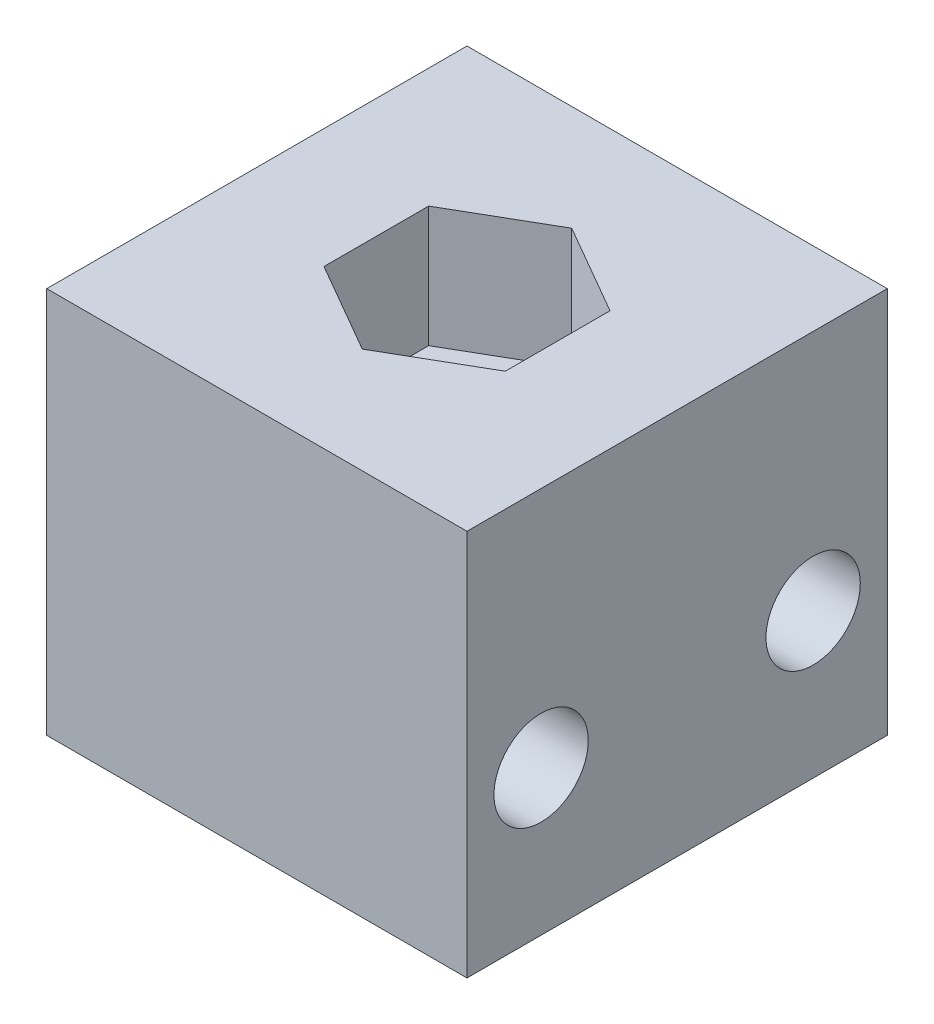
ISO-10303-21;
HEADER;
FILE_DESCRIPTION(('STEP AP214'),'2;1');
FILE_NAME('part.step','',(''),(''),'','','');
FILE_SCHEMA(('AUTOMOTIVE_DESIGN { 1 0 10303 214 1 1 1 1 }'));
ENDSEC;
DATA;
#1=APPLICATION_CONTEXT('core data for automotive mechanical design processes');
#2=APPLICATION_PROTOCOL_DEFINITION('international standard','automotive_design',2000,#1);
#3=PRODUCT_CONTEXT('',#1,'mechanical');
#4=PRODUCT('Part','Part','',(#3));
#5=PRODUCT_RELATED_PRODUCT_CATEGORY('part','',(#4));
#6=PRODUCT_DEFINITION_FORMATION('','',#4);
#7=PRODUCT_DEFINITION_CONTEXT('part definition',#1,'design');
#8=PRODUCT_DEFINITION('design','',#6,#7);
#9=PRODUCT_DEFINITION_SHAPE('','',#8);
#10=(LENGTH_UNIT() NAMED_UNIT(*) SI_UNIT(.MILLI.,.METRE.));
#11=(NAMED_UNIT(*) PLANE_ANGLE_UNIT() SI_UNIT($,.RADIAN.));
#12=(NAMED_UNIT(*) SI_UNIT($,.STERADIAN.) SOLID_ANGLE_UNIT());
#13=UNCERTAINTY_MEASURE_WITH_UNIT(LENGTH_MEASURE(1.E-05),#10,'distance_accuracy_value','');
#14=(GEOMETRIC_REPRESENTATION_CONTEXT(3) GLOBAL_UNCERTAINTY_ASSIGNED_CONTEXT((#13)) GLOBAL_UNIT_ASSIGNED_CONTEXT((#10,
#11,#12)) REPRESENTATION_CONTEXT('',''));
#15=CARTESIAN_POINT('',(0.,0.,0.));
#16=DIRECTION('',(0.,0.,1.));
#17=DIRECTION('',(1.,0.,0.));
#18=AXIS2_PLACEMENT_3D('',#15,#16,#17);
#19=CARTESIAN_POINT('',(0.,0.,0.));
#20=DIRECTION('',(0.,-1.,0.));
#21=DIRECTION('',(0.,0.,-1.));
#22=AXIS2_PLACEMENT_3D('',#19,#20,#21);
#23=CYLINDRICAL_SURFACE('',#22,2.4892);
#24=CARTESIAN_POINT('',(0.,0.,0.));
#25=DIRECTION('',(0.,-1.,0.));
#26=DIRECTION('',(0.,0.,-1.));
#27=AXIS2_PLACEMENT_3D('',#24,#25,#26);
#28=CIRCLE('',#27,2.4892);
#29=CARTESIAN_POINT('',(0.,0.,-2.4892));
#30=VERTEX_POINT('',#29);
#31=EDGE_CURVE('E182',#30,#30,#28,.T.);
#32=ORIENTED_EDGE('',*,*,#31,.T.);
#33=EDGE_LOOP('',(#32));
#34=FACE_BOUND('',#33,.T.);
#35=CARTESIAN_POINT('',(0.,13.97,0.));
#36=DIRECTION('',(0.,1.,0.));
#37=DIRECTION('',(0.,0.,1.));
#38=AXIS2_PLACEMENT_3D('',#35,#36,#37);
#39=CIRCLE('',#38,2.4892);
#40=CARTESIAN_POINT('',(0.,13.97,2.4892));
#41=VERTEX_POINT('',#40);
#42=EDGE_CURVE('E41',#41,#41,#39,.F.);
#43=ORIENTED_EDGE('',*,*,#42,.F.);
#44=EDGE_LOOP('',(#43));
#45=FACE_BOUND('',#44,.T.);
#46=ADVANCED_FACE('F37',(#34,#45),#23,.F.);
#47=CARTESIAN_POINT('',(11.0363,20.32,11.0363));
#48=DIRECTION('',(-1.,0.,0.));
#49=DIRECTION('',(0.,0.,1.));
#50=AXIS2_PLACEMENT_3D('',#47,#48,#49);
#51=PLANE('',#50);
#52=CARTESIAN_POINT('',(11.0363,7.62,7.14375));
#53=DIRECTION('',(1.,0.,0.));
#54=DIRECTION('',(0.,0.,-1.));
#55=AXIS2_PLACEMENT_3D('',#52,#53,#54);
#56=CIRCLE('',#55,2.4765);
#57=CARTESIAN_POINT('',(11.0363,7.62,4.66725));
#58=VERTEX_POINT('',#57);
#59=EDGE_CURVE('E183',#58,#58,#56,.T.);
#60=ORIENTED_EDGE('',*,*,#59,.F.);
#61=EDGE_LOOP('',(#60));
#62=FACE_BOUND('',#61,.T.);
#63=CARTESIAN_POINT('',(11.0363,7.62,-7.14375));
#64=DIRECTION('',(1.,0.,0.));
#65=DIRECTION('',(0.,0.,-1.));
#66=AXIS2_PLACEMENT_3D('',#63,#64,#65);
#67=CIRCLE('',#66,2.4765);
#68=CARTESIAN_POINT('',(11.0363,7.62,-9.62025));
#69=VERTEX_POINT('',#68);
#70=EDGE_CURVE('E189',#69,#69,#67,.T.);
#71=ORIENTED_EDGE('',*,*,#70,.F.);
#72=EDGE_LOOP('',(#71));
#73=FACE_BOUND('',#72,.T.);
#74=DIRECTION('',(0.,0.,-1.));
#75=VECTOR('',#74,1.);
#76=CARTESIAN_POINT('',(11.0363,0.,11.0363));
#77=LINE('',#76,#75);
#78=CARTESIAN_POINT('',(11.0363,0.,11.0363));
#79=VERTEX_POINT('',#78);
#80=CARTESIAN_POINT('',(11.0363,0.,-11.0363));
#81=VERTEX_POINT('',#80);
#82=EDGE_CURVE('E194',#79,#81,#77,.T.);
#83=ORIENTED_EDGE('',*,*,#82,.T.);
#84=DIRECTION('',(0.,-1.,0.));
#85=VECTOR('',#84,1.);
#86=CARTESIAN_POINT('',(11.0363,20.32,-11.0363));
#87=LINE('',#86,#85);
#88=CARTESIAN_POINT('',(11.0363,20.32,-11.0363));
#89=VERTEX_POINT('',#88);
#90=EDGE_CURVE('E11',#89,#81,#87,.T.);
#91=ORIENTED_EDGE('',*,*,#90,.F.);
#92=DIRECTION('',(0.,0.,-1.));
#93=VECTOR('',#92,1.);
#94=CARTESIAN_POINT('',(11.0363,20.32,11.0363));
#95=LINE('',#94,#93);
#96=CARTESIAN_POINT('',(11.0363,20.32,11.0363));
#97=VERTEX_POINT('',#96);
#98=EDGE_CURVE('E195',#97,#89,#95,.T.);
#99=ORIENTED_EDGE('',*,*,#98,.F.);
#100=DIRECTION('',(0.,-1.,0.));
#101=VECTOR('',#100,1.);
#102=CARTESIAN_POINT('',(11.0363,20.32,11.0363));
#103=LINE('',#102,#101);
#104=EDGE_CURVE('E201',#97,#79,#103,.T.);
#105=ORIENTED_EDGE('',*,*,#104,.T.);
#106=EDGE_LOOP('',(#83,#91,#99,#105));
#107=FACE_BOUND('',#106,.T.);
#108=ADVANCED_FACE('F39',(#62,#73,#107),#51,.F.);
#109=CARTESIAN_POINT('',(-11.0363,20.32,-11.0363));
#110=DIRECTION('',(0.,0.,1.));
#111=DIRECTION('',(1.,0.,0.));
#112=AXIS2_PLACEMENT_3D('',#109,#110,#111);
#113=PLANE('',#112);
#114=DIRECTION('',(-1.,0.,0.));
#115=VECTOR('',#114,1.);
#116=CARTESIAN_POINT('',(-11.0363,0.,-11.0363));
#117=LINE('',#116,#115);
#118=CARTESIAN_POINT('',(-11.0363,0.,-11.0363));
#119=VERTEX_POINT('',#118);
#120=EDGE_CURVE('E204',#81,#119,#117,.T.);
#121=ORIENTED_EDGE('',*,*,#120,.T.);
#122=DIRECTION('',(0.,-1.,0.));
#123=VECTOR('',#122,1.);
#124=CARTESIAN_POINT('',(-11.0363,20.32,-11.0363));
#125=LINE('',#124,#123);
#126=CARTESIAN_POINT('',(-11.0363,20.32,-11.0363));
#127=VERTEX_POINT('',#126);
#128=EDGE_CURVE('E46',#127,#119,#125,.T.);
#129=ORIENTED_EDGE('',*,*,#128,.F.);
#130=DIRECTION('',(-1.,0.,0.));
#131=VECTOR('',#130,1.);
#132=CARTESIAN_POINT('',(-11.0363,20.32,-11.0363));
#133=LINE('',#132,#131);
#134=EDGE_CURVE('E90',#89,#127,#133,.T.);
#135=ORIENTED_EDGE('',*,*,#134,.F.);
#136=ORIENTED_EDGE('',*,*,#90,.T.);
#137=EDGE_LOOP('',(#121,#129,#135,#136));
#138=FACE_BOUND('',#137,.T.);
#139=ADVANCED_FACE('F234',(#138),#113,.F.);
#140=CARTESIAN_POINT('',(-11.0363,20.32,11.0363));
#141=DIRECTION('',(1.,0.,0.));
#142=DIRECTION('',(0.,0.,-1.));
#143=AXIS2_PLACEMENT_3D('',#140,#141,#142);
#144=PLANE('',#143);
#145=CARTESIAN_POINT('',(-11.0363,7.62,7.14375));
#146=DIRECTION('',(1.,0.,0.));
#147=DIRECTION('',(0.,0.,-1.));
#148=AXIS2_PLACEMENT_3D('',#145,#146,#147);
#149=CIRCLE('',#148,2.4765);
#150=CARTESIAN_POINT('',(-11.0363,7.62,4.66725));
#151=VERTEX_POINT('',#150);
#152=EDGE_CURVE('E179',#151,#151,#149,.T.);
#153=ORIENTED_EDGE('',*,*,#152,.T.);
#154=EDGE_LOOP('',(#153));
#155=FACE_BOUND('',#154,.T.);
#156=CARTESIAN_POINT('',(-11.0363,7.62,-7.14375));
#157=DIRECTION('',(1.,0.,0.));
#158=DIRECTION('',(0.,0.,-1.));
#159=AXIS2_PLACEMENT_3D('',#156,#157,#158);
#160=CIRCLE('',#159,2.4765);
#161=CARTESIAN_POINT('',(-11.0363,7.62,-9.62025));
#162=VERTEX_POINT('',#161);
#163=EDGE_CURVE('E186',#162,#162,#160,.T.);
#164=ORIENTED_EDGE('',*,*,#163,.T.);
#165=EDGE_LOOP('',(#164));
#166=FACE_BOUND('',#165,.T.);
#167=DIRECTION('',(0.,0.,1.));
#168=VECTOR('',#167,1.);
#169=CARTESIAN_POINT('',(-11.0363,0.,11.0363));
#170=LINE('',#169,#168);
#171=CARTESIAN_POINT('',(-11.0363,0.,11.0363));
#172=VERTEX_POINT('',#171);
#173=EDGE_CURVE('E206',#119,#172,#170,.T.);
#174=ORIENTED_EDGE('',*,*,#173,.T.);
#175=DIRECTION('',(0.,-1.,0.));
#176=VECTOR('',#175,1.);
#177=CARTESIAN_POINT('',(-11.0363,20.32,11.0363));
#178=LINE('',#177,#176);
#179=CARTESIAN_POINT('',(-11.0363,20.32,11.0363));
#180=VERTEX_POINT('',#179);
#181=EDGE_CURVE('E210',#180,#172,#178,.T.);
#182=ORIENTED_EDGE('',*,*,#181,.F.);
#183=DIRECTION('',(0.,0.,1.));
#184=VECTOR('',#183,1.);
#185=CARTESIAN_POINT('',(-11.0363,20.32,11.0363));
#186=LINE('',#185,#184);
#187=EDGE_CURVE('E198',#127,#180,#186,.T.);
#188=ORIENTED_EDGE('',*,*,#187,.F.);
#189=ORIENTED_EDGE('',*,*,#128,.T.);
#190=EDGE_LOOP('',(#174,#182,#188,#189));
#191=FACE_BOUND('',#190,.T.);
#192=ADVANCED_FACE('F216',(#155,#166,#191),#144,.F.);
#193=CARTESIAN_POINT('',(-11.0363,20.32,11.0363));
#194=DIRECTION('',(0.,0.,-1.));
#195=DIRECTION('',(-1.,0.,0.));
#196=AXIS2_PLACEMENT_3D('',#193,#194,#195);
#197=PLANE('',#196);
#198=DIRECTION('',(1.,0.,0.));
#199=VECTOR('',#198,1.);
#200=CARTESIAN_POINT('',(-11.0363,0.,11.0363));
#201=LINE('',#200,#199);
#202=EDGE_CURVE('E83',#172,#79,#201,.T.);
#203=ORIENTED_EDGE('',*,*,#202,.T.);
#204=ORIENTED_EDGE('',*,*,#104,.F.);
#205=DIRECTION('',(1.,0.,0.));
#206=VECTOR('',#205,1.);
#207=CARTESIAN_POINT('',(-11.0363,20.32,11.0363));
#208=LINE('',#207,#206);
#209=EDGE_CURVE('E62',#180,#97,#208,.T.);
#210=ORIENTED_EDGE('',*,*,#209,.F.);
#211=ORIENTED_EDGE('',*,*,#181,.T.);
#212=EDGE_LOOP('',(#203,#204,#210,#211));
#213=FACE_BOUND('',#212,.T.);
#214=ADVANCED_FACE('F224',(#213),#197,.F.);
#215=CARTESIAN_POINT('',(0.,20.32,0.));
#216=DIRECTION('',(0.,-1.,0.));
#217=DIRECTION('',(0.,0.,-1.));
#218=AXIS2_PLACEMENT_3D('',#215,#216,#217);
#219=PLANE('',#218);
#220=DIRECTION('',(-0.866025403784439,0.,0.5));
#221=VECTOR('',#220,1.);
#222=CARTESIAN_POINT('',(0.,20.32,-5.49926131403119));
#223=LINE('',#222,#221);
#224=CARTESIAN_POINT('',(0.,20.32,-5.49926131403119));
#225=VERTEX_POINT('',#224);
#226=CARTESIAN_POINT('',(-4.7625,20.32,-2.74963065701559));
#227=VERTEX_POINT('',#226);
#228=EDGE_CURVE('E160',#225,#227,#223,.T.);
#229=ORIENTED_EDGE('',*,*,#228,.F.);
#230=DIRECTION('',(-0.866025403784439,0.,-0.5));
#231=VECTOR('',#230,1.);
#232=CARTESIAN_POINT('',(4.7625,20.32,-2.74963065701559));
#233=LINE('',#232,#231);
#234=CARTESIAN_POINT('',(4.7625,20.32,-2.74963065701559));
#235=VERTEX_POINT('',#234);
#236=EDGE_CURVE('E53',#235,#225,#233,.T.);
#237=ORIENTED_EDGE('',*,*,#236,.F.);
#238=DIRECTION('',(0.,0.,-1.));
#239=VECTOR('',#238,1.);
#240=CARTESIAN_POINT('',(4.7625,20.32,2.74963065701559));
#241=LINE('',#240,#239);
#242=CARTESIAN_POINT('',(4.7625,20.32,2.74963065701559));
#243=VERTEX_POINT('',#242);
#244=EDGE_CURVE('E146',#243,#235,#241,.T.);
#245=ORIENTED_EDGE('',*,*,#244,.F.);
#246=DIRECTION('',(0.866025403784439,0.,-0.5));
#247=VECTOR('',#246,1.);
#248=CARTESIAN_POINT('',(0.,20.32,5.49926131403118));
#249=LINE('',#248,#247);
#250=CARTESIAN_POINT('',(0.,20.32,5.49926131403118));
#251=VERTEX_POINT('',#250);
#252=EDGE_CURVE('E149',#251,#243,#249,.T.);
#253=ORIENTED_EDGE('',*,*,#252,.F.);
#254=DIRECTION('',(0.866025403784439,0.,0.5));
#255=VECTOR('',#254,1.);
#256=CARTESIAN_POINT('',(-4.7625,20.32,2.74963065701559));
#257=LINE('',#256,#255);
#258=CARTESIAN_POINT('',(-4.7625,20.32,2.74963065701559));
#259=VERTEX_POINT('',#258);
#260=EDGE_CURVE('E165',#259,#251,#257,.T.);
#261=ORIENTED_EDGE('',*,*,#260,.F.);
#262=DIRECTION('',(0.,0.,1.));
#263=VECTOR('',#262,1.);
#264=CARTESIAN_POINT('',(-4.7625,20.32,-2.74963065701559));
#265=LINE('',#264,#263);
#266=EDGE_CURVE('E162',#227,#259,#265,.T.);
#267=ORIENTED_EDGE('',*,*,#266,.F.);
#268=EDGE_LOOP('',(#229,#237,#245,#253,#261,#267));
#269=FACE_BOUND('',#268,.T.);
#270=ORIENTED_EDGE('',*,*,#98,.T.);
#271=ORIENTED_EDGE('',*,*,#134,.T.);
#272=ORIENTED_EDGE('',*,*,#187,.T.);
#273=ORIENTED_EDGE('',*,*,#209,.T.);
#274=EDGE_LOOP('',(#270,#271,#272,#273));
#275=FACE_BOUND('',#274,.T.);
#276=ADVANCED_FACE('F226',(#269,#275),#219,.F.);
#277=CARTESIAN_POINT('',(0.,0.,0.));
#278=DIRECTION('',(0.,-1.,0.));
#279=DIRECTION('',(0.,0.,-1.));
#280=AXIS2_PLACEMENT_3D('',#277,#278,#279);
#281=PLANE('',#280);
#282=ORIENTED_EDGE('',*,*,#31,.F.);
#283=EDGE_LOOP('',(#282));
#284=FACE_BOUND('',#283,.T.);
#285=ORIENTED_EDGE('',*,*,#82,.F.);
#286=ORIENTED_EDGE('',*,*,#202,.F.);
#287=ORIENTED_EDGE('',*,*,#173,.F.);
#288=ORIENTED_EDGE('',*,*,#120,.F.);
#289=EDGE_LOOP('',(#285,#286,#287,#288));
#290=FACE_BOUND('',#289,.T.);
#291=ADVANCED_FACE('F220',(#284,#290),#281,.T.);
#292=CARTESIAN_POINT('',(-11.0363,7.62,-7.14375));
#293=DIRECTION('',(1.,0.,0.));
#294=DIRECTION('',(0.,0.,-1.));
#295=AXIS2_PLACEMENT_3D('',#292,#293,#294);
#296=CYLINDRICAL_SURFACE('',#295,2.4765);
#297=CARTESIAN_POINT('',(-11.0363,7.62,-9.62025));
#298=CARTESIAN_POINT('',(-10.8063770833333,7.62,-9.62025));
#299=CARTESIAN_POINT('',(-10.5764541666667,7.62,-9.62025));
#300=CARTESIAN_POINT('',(-10.1166083333333,7.62,-9.62025));
#301=CARTESIAN_POINT('',(-9.88668541666667,7.62,-9.62025));
#302=CARTESIAN_POINT('',(-9.42683958333334,7.62,-9.62025));
#303=CARTESIAN_POINT('',(-9.19691666666667,7.62,-9.62025));
#304=CARTESIAN_POINT('',(-8.73707083333334,7.62,-9.62025));
#305=CARTESIAN_POINT('',(-8.50714791666667,7.62,-9.62025));
#306=CARTESIAN_POINT('',(-8.04730208333334,7.62,-9.62025));
#307=CARTESIAN_POINT('',(-7.81737916666667,7.62,-9.62025));
#308=CARTESIAN_POINT('',(-7.35753333333334,7.62,-9.62025));
#309=CARTESIAN_POINT('',(-7.12761041666667,7.62,-9.62025));
#310=CARTESIAN_POINT('',(-6.66776458333334,7.62,-9.62025));
#311=CARTESIAN_POINT('',(-6.43784166666667,7.62,-9.62025));
#312=CARTESIAN_POINT('',(-5.97799583333334,7.62,-9.62025));
#313=CARTESIAN_POINT('',(-5.74807291666667,7.62,-9.62025));
#314=CARTESIAN_POINT('',(-5.28822708333334,7.62,-9.62025));
#315=CARTESIAN_POINT('',(-5.05830416666667,7.62,-9.62025));
#316=CARTESIAN_POINT('',(-4.59845833333334,7.62,-9.62025));
#317=CARTESIAN_POINT('',(-4.36853541666667,7.62,-9.62025));
#318=CARTESIAN_POINT('',(-3.90868958333334,7.62,-9.62025));
#319=CARTESIAN_POINT('',(-3.67876666666667,7.62,-9.62025));
#320=CARTESIAN_POINT('',(-3.21892083333334,7.62,-9.62025));
#321=CARTESIAN_POINT('',(-2.98899791666667,7.62,-9.62025));
#322=CARTESIAN_POINT('',(-2.52915208333334,7.62,-9.62025));
#323=CARTESIAN_POINT('',(-2.29922916666667,7.62,-9.62025));
#324=CARTESIAN_POINT('',(-1.83938333333334,7.62,-9.62025));
#325=CARTESIAN_POINT('',(-1.60946041666667,7.62,-9.62025));
#326=CARTESIAN_POINT('',(-1.14961458333334,7.62,-9.62025));
#327=CARTESIAN_POINT('',(-0.919691666666672,7.62,-9.62025));
#328=CARTESIAN_POINT('',(-0.459845833333339,7.62,-9.62025));
#329=CARTESIAN_POINT('',(-0.229922916666672,7.62,-9.62025));
#330=CARTESIAN_POINT('',(0.229922916666661,7.62,-9.62025));
#331=CARTESIAN_POINT('',(0.459845833333328,7.62,-9.62025));
#332=CARTESIAN_POINT('',(0.919691666666661,7.62,-9.62025));
#333=CARTESIAN_POINT('',(1.14961458333333,7.62,-9.62025));
#334=CARTESIAN_POINT('',(1.60946041666666,7.62,-9.62025));
#335=CARTESIAN_POINT('',(1.83938333333333,7.62,-9.62025));
#336=CARTESIAN_POINT('',(2.29922916666666,7.62,-9.62025));
#337=CARTESIAN_POINT('',(2.52915208333333,7.62,-9.62025));
#338=CARTESIAN_POINT('',(2.98899791666666,7.62,-9.62025));
#339=CARTESIAN_POINT('',(3.21892083333333,7.62,-9.62025));
#340=CARTESIAN_POINT('',(3.67876666666666,7.62,-9.62025));
#341=CARTESIAN_POINT('',(3.90868958333333,7.62,-9.62025));
#342=CARTESIAN_POINT('',(4.36853541666666,7.62,-9.62025));
#343=CARTESIAN_POINT('',(4.59845833333333,7.62,-9.62025));
#344=CARTESIAN_POINT('',(5.05830416666666,7.62,-9.62025));
#345=CARTESIAN_POINT('',(5.28822708333333,7.62,-9.62025));
#346=CARTESIAN_POINT('',(5.74807291666666,7.62,-9.62025));
#347=CARTESIAN_POINT('',(5.97799583333333,7.62,-9.62025));
#348=CARTESIAN_POINT('',(6.43784166666666,7.62,-9.62025));
#349=CARTESIAN_POINT('',(6.66776458333333,7.62,-9.62025));
#350=CARTESIAN_POINT('',(7.12761041666666,7.62,-9.62025));
#351=CARTESIAN_POINT('',(7.35753333333333,7.62,-9.62025));
#352=CARTESIAN_POINT('',(7.81737916666666,7.62,-9.62025));
#353=CARTESIAN_POINT('',(8.04730208333333,7.62,-9.62025));
#354=CARTESIAN_POINT('',(8.50714791666666,7.62,-9.62025));
#355=CARTESIAN_POINT('',(8.73707083333333,7.62,-9.62025));
#356=CARTESIAN_POINT('',(9.19691666666666,7.62,-9.62025));
#357=CARTESIAN_POINT('',(9.42683958333333,7.62,-9.62025));
#358=CARTESIAN_POINT('',(9.88668541666666,7.62,-9.62025));
#359=CARTESIAN_POINT('',(10.1166083333333,7.62,-9.62025));
#360=CARTESIAN_POINT('',(10.5764541666667,7.62,-9.62025));
#361=CARTESIAN_POINT('',(10.8063770833333,7.62,-9.62025));
#362=CARTESIAN_POINT('',(11.0363,7.62,-9.62025));
#363=B_SPLINE_CURVE_WITH_KNOTS('',3,(#297,#298,#299,#300,#301,#302,#303,#304,#305,#306,#307,
#308,#309,#310,#311,#312,#313,#314,#315,#316,#317,#318,#319,#320,#321,#322,#323,#324,#325,#326,
#327,#328,#329,#330,#331,#332,#333,#334,#335,#336,#337,#338,#339,#340,#341,#342,#343,#344,#345,
#346,#347,#348,#349,#350,#351,#352,#353,#354,#355,#356,#357,#358,#359,#360,#361,#362),
.UNSPECIFIED.,.F.,.F.,(4,2,2,2,2,2,2,2,2,2,2,2,2,2,2,2,2,2,2,2,2,2,2,2,2,2,2,2,2,2,2,2,4),(0.,
0.68976875,1.3795375,2.06930625,2.759075,3.44884375,4.1386125,4.82838125,5.51815,6.20791875,
6.8976875,7.58745625,8.277225,8.96699375,9.6567625,10.34653125,11.0363,11.72606875,12.4158375,
13.10560625,13.795375,14.48514375,15.1749125,15.86468125,16.55445,17.24421875,17.9339875,
18.62375625,19.313525,20.00329375,20.6930625,21.38283125,22.0726),.UNSPECIFIED.);
#364=EDGE_CURVE('BSEAM247',#162,#69,#363,.T.);
#365=ORIENTED_EDGE('',*,*,#163,.F.);
#366=ORIENTED_EDGE('',*,*,#70,.T.);
#367=ORIENTED_EDGE('',*,*,#364,.T.);
#368=ORIENTED_EDGE('',*,*,#364,.F.);
#369=EDGE_LOOP('',(#365,#367,#366,#368));
#370=FACE_BOUND('',#369,.T.);
#371=ADVANCED_FACE('F247',(#370),#296,.F.);
#372=CARTESIAN_POINT('',(-11.0363,7.62,7.14375));
#373=DIRECTION('',(1.,0.,0.));
#374=DIRECTION('',(0.,0.,-1.));
#375=AXIS2_PLACEMENT_3D('',#372,#373,#374);
#376=CYLINDRICAL_SURFACE('',#375,2.4765);
#377=CARTESIAN_POINT('',(-11.0363,7.62,4.66725));
#378=CARTESIAN_POINT('',(-10.8063770833333,7.62,4.66725));
#379=CARTESIAN_POINT('',(-10.5764541666667,7.62,4.66725));
#380=CARTESIAN_POINT('',(-10.1166083333333,7.62,4.66725));
#381=CARTESIAN_POINT('',(-9.88668541666667,7.62,4.66725));
#382=CARTESIAN_POINT('',(-9.42683958333334,7.62,4.66725));
#383=CARTESIAN_POINT('',(-9.19691666666667,7.62,4.66725));
#384=CARTESIAN_POINT('',(-8.73707083333334,7.62,4.66725));
#385=CARTESIAN_POINT('',(-8.50714791666667,7.62,4.66725));
#386=CARTESIAN_POINT('',(-8.04730208333334,7.62,4.66725));
#387=CARTESIAN_POINT('',(-7.81737916666667,7.62,4.66725));
#388=CARTESIAN_POINT('',(-7.35753333333334,7.62,4.66725));
#389=CARTESIAN_POINT('',(-7.12761041666667,7.62,4.66725));
#390=CARTESIAN_POINT('',(-6.66776458333334,7.62,4.66725));
#391=CARTESIAN_POINT('',(-6.43784166666667,7.62,4.66725));
#392=CARTESIAN_POINT('',(-5.97799583333334,7.62,4.66725));
#393=CARTESIAN_POINT('',(-5.74807291666667,7.62,4.66725));
#394=CARTESIAN_POINT('',(-5.28822708333334,7.62,4.66725));
#395=CARTESIAN_POINT('',(-5.05830416666667,7.62,4.66725));
#396=CARTESIAN_POINT('',(-4.59845833333334,7.62,4.66725));
#397=CARTESIAN_POINT('',(-4.36853541666667,7.62,4.66725));
#398=CARTESIAN_POINT('',(-3.90868958333334,7.62,4.66725));
#399=CARTESIAN_POINT('',(-3.67876666666667,7.62,4.66725));
#400=CARTESIAN_POINT('',(-3.21892083333334,7.62,4.66725));
#401=CARTESIAN_POINT('',(-2.98899791666667,7.62,4.66725));
#402=CARTESIAN_POINT('',(-2.52915208333334,7.62,4.66725));
#403=CARTESIAN_POINT('',(-2.29922916666667,7.62,4.66725));
#404=CARTESIAN_POINT('',(-1.83938333333334,7.62,4.66725));
#405=CARTESIAN_POINT('',(-1.60946041666667,7.62,4.66725));
#406=CARTESIAN_POINT('',(-1.14961458333334,7.62,4.66725));
#407=CARTESIAN_POINT('',(-0.919691666666672,7.62,4.66725));
#408=CARTESIAN_POINT('',(-0.459845833333339,7.62,4.66725));
#409=CARTESIAN_POINT('',(-0.229922916666672,7.62,4.66725));
#410=CARTESIAN_POINT('',(0.229922916666661,7.62,4.66725));
#411=CARTESIAN_POINT('',(0.459845833333328,7.62,4.66725));
#412=CARTESIAN_POINT('',(0.919691666666661,7.62,4.66725));
#413=CARTESIAN_POINT('',(1.14961458333333,7.62,4.66725));
#414=CARTESIAN_POINT('',(1.60946041666666,7.62,4.66725));
#415=CARTESIAN_POINT('',(1.83938333333333,7.62,4.66725));
#416=CARTESIAN_POINT('',(2.29922916666666,7.62,4.66725));
#417=CARTESIAN_POINT('',(2.52915208333333,7.62,4.66725));
#418=CARTESIAN_POINT('',(2.98899791666666,7.62,4.66725));
#419=CARTESIAN_POINT('',(3.21892083333333,7.62,4.66725));
#420=CARTESIAN_POINT('',(3.67876666666666,7.62,4.66725));
#421=CARTESIAN_POINT('',(3.90868958333333,7.62,4.66725));
#422=CARTESIAN_POINT('',(4.36853541666666,7.62,4.66725));
#423=CARTESIAN_POINT('',(4.59845833333333,7.62,4.66725));
#424=CARTESIAN_POINT('',(5.05830416666666,7.62,4.66725));
#425=CARTESIAN_POINT('',(5.28822708333333,7.62,4.66725));
#426=CARTESIAN_POINT('',(5.74807291666666,7.62,4.66725));
#427=CARTESIAN_POINT('',(5.97799583333333,7.62,4.66725));
#428=CARTESIAN_POINT('',(6.43784166666666,7.62,4.66725));
#429=CARTESIAN_POINT('',(6.66776458333333,7.62,4.66725));
#430=CARTESIAN_POINT('',(7.12761041666666,7.62,4.66725));
#431=CARTESIAN_POINT('',(7.35753333333333,7.62,4.66725));
#432=CARTESIAN_POINT('',(7.81737916666666,7.62,4.66725));
#433=CARTESIAN_POINT('',(8.04730208333333,7.62,4.66725));
#434=CARTESIAN_POINT('',(8.50714791666666,7.62,4.66725));
#435=CARTESIAN_POINT('',(8.73707083333333,7.62,4.66725));
#436=CARTESIAN_POINT('',(9.19691666666666,7.62,4.66725));
#437=CARTESIAN_POINT('',(9.42683958333333,7.62,4.66725));
#438=CARTESIAN_POINT('',(9.88668541666666,7.62,4.66725));
#439=CARTESIAN_POINT('',(10.1166083333333,7.62,4.66725));
#440=CARTESIAN_POINT('',(10.5764541666667,7.62,4.66725));
#441=CARTESIAN_POINT('',(10.8063770833333,7.62,4.66725));
#442=CARTESIAN_POINT('',(11.0363,7.62,4.66725));
#443=B_SPLINE_CURVE_WITH_KNOTS('',3,(#377,#378,#379,#380,#381,#382,#383,#384,#385,#386,#387,
#388,#389,#390,#391,#392,#393,#394,#395,#396,#397,#398,#399,#400,#401,#402,#403,#404,#405,#406,
#407,#408,#409,#410,#411,#412,#413,#414,#415,#416,#417,#418,#419,#420,#421,#422,#423,#424,#425,
#426,#427,#428,#429,#430,#431,#432,#433,#434,#435,#436,#437,#438,#439,#440,#441,#442),
.UNSPECIFIED.,.F.,.F.,(4,2,2,2,2,2,2,2,2,2,2,2,2,2,2,2,2,2,2,2,2,2,2,2,2,2,2,2,2,2,2,2,4),(0.,
0.68976875,1.3795375,2.06930625,2.759075,3.44884375,4.1386125,4.82838125,5.51815,6.20791875,
6.8976875,7.58745625,8.277225,8.96699375,9.6567625,10.34653125,11.0363,11.72606875,12.4158375,
13.10560625,13.795375,14.48514375,15.1749125,15.86468125,16.55445,17.24421875,17.9339875,
18.62375625,19.313525,20.00329375,20.6930625,21.38283125,22.0726),.UNSPECIFIED.);
#444=EDGE_CURVE('BSEAM254',#151,#58,#443,.T.);
#445=ORIENTED_EDGE('',*,*,#152,.F.);
#446=ORIENTED_EDGE('',*,*,#59,.T.);
#447=ORIENTED_EDGE('',*,*,#444,.T.);
#448=ORIENTED_EDGE('',*,*,#444,.F.);
#449=EDGE_LOOP('',(#445,#447,#446,#448));
#450=FACE_BOUND('',#449,.T.);
#451=ADVANCED_FACE('F254',(#450),#376,.F.);
#452=CARTESIAN_POINT('',(0.,13.97,0.));
#453=DIRECTION('',(0.,1.,0.));
#454=DIRECTION('',(0.,0.,1.));
#455=AXIS2_PLACEMENT_3D('',#452,#453,#454);
#456=PLANE('',#455);
#457=DIRECTION('',(-0.866025403784439,0.,-0.5));
#458=VECTOR('',#457,1.);
#459=CARTESIAN_POINT('',(4.7625,13.97,-2.74963065701559));
#460=LINE('',#459,#458);
#461=CARTESIAN_POINT('',(4.7625,13.97,-2.74963065701559));
#462=VERTEX_POINT('',#461);
#463=CARTESIAN_POINT('',(0.,13.97,-5.49926131403119));
#464=VERTEX_POINT('',#463);
#465=EDGE_CURVE('E126',#462,#464,#460,.T.);
#466=ORIENTED_EDGE('',*,*,#465,.T.);
#467=DIRECTION('',(-0.866025403784439,0.,0.5));
#468=VECTOR('',#467,1.);
#469=CARTESIAN_POINT('',(0.,13.97,-5.49926131403119));
#470=LINE('',#469,#468);
#471=CARTESIAN_POINT('',(-4.7625,13.97,-2.74963065701559));
#472=VERTEX_POINT('',#471);
#473=EDGE_CURVE('E135',#464,#472,#470,.T.);
#474=ORIENTED_EDGE('',*,*,#473,.T.);
#475=DIRECTION('',(0.,0.,1.));
#476=VECTOR('',#475,1.);
#477=CARTESIAN_POINT('',(-4.7625,13.97,-2.74963065701559));
#478=LINE('',#477,#476);
#479=CARTESIAN_POINT('',(-4.7625,13.97,2.74963065701559));
#480=VERTEX_POINT('',#479);
#481=EDGE_CURVE('E140',#472,#480,#478,.T.);
#482=ORIENTED_EDGE('',*,*,#481,.T.);
#483=DIRECTION('',(0.866025403784439,0.,0.5));
#484=VECTOR('',#483,1.);
#485=CARTESIAN_POINT('',(-4.7625,13.97,2.74963065701559));
#486=LINE('',#485,#484);
#487=CARTESIAN_POINT('',(0.,13.97,5.49926131403118));
#488=VERTEX_POINT('',#487);
#489=EDGE_CURVE('E153',#480,#488,#486,.T.);
#490=ORIENTED_EDGE('',*,*,#489,.T.);
#491=DIRECTION('',(0.866025403784439,0.,-0.5));
#492=VECTOR('',#491,1.);
#493=CARTESIAN_POINT('',(0.,13.97,5.49926131403118));
#494=LINE('',#493,#492);
#495=CARTESIAN_POINT('',(4.7625,13.97,2.74963065701559));
#496=VERTEX_POINT('',#495);
#497=EDGE_CURVE('E156',#488,#496,#494,.T.);
#498=ORIENTED_EDGE('',*,*,#497,.T.);
#499=DIRECTION('',(0.,0.,-1.));
#500=VECTOR('',#499,1.);
#501=CARTESIAN_POINT('',(4.7625,13.97,2.74963065701559));
#502=LINE('',#501,#500);
#503=EDGE_CURVE('E132',#496,#462,#502,.T.);
#504=ORIENTED_EDGE('',*,*,#503,.T.);
#505=EDGE_LOOP('',(#466,#474,#482,#490,#498,#504));
#506=FACE_BOUND('',#505,.T.);
#507=ORIENTED_EDGE('',*,*,#42,.T.);
#508=EDGE_LOOP('',(#507));
#509=FACE_BOUND('',#508,.T.);
#510=ADVANCED_FACE('F142',(#506,#509),#456,.T.);
#511=CARTESIAN_POINT('',(4.7625,13.97,-2.74963065701559));
#512=DIRECTION('',(0.5,0.,-0.866025403784439));
#513=DIRECTION('',(-0.866025403784439,0.,-0.5));
#514=AXIS2_PLACEMENT_3D('',#511,#512,#513);
#515=PLANE('',#514);
#516=ORIENTED_EDGE('',*,*,#236,.T.);
#517=DIRECTION('',(0.,1.,0.));
#518=VECTOR('',#517,1.);
#519=CARTESIAN_POINT('',(0.,13.97,-5.49926131403119));
#520=LINE('',#519,#518);
#521=EDGE_CURVE('E122',#464,#225,#520,.T.);
#522=ORIENTED_EDGE('',*,*,#521,.F.);
#523=ORIENTED_EDGE('',*,*,#465,.F.);
#524=DIRECTION('',(0.,1.,0.));
#525=VECTOR('',#524,1.);
#526=CARTESIAN_POINT('',(4.7625,13.97,-2.74963065701559));
#527=LINE('',#526,#525);
#528=EDGE_CURVE('E170',#462,#235,#527,.T.);
#529=ORIENTED_EDGE('',*,*,#528,.T.);
#530=EDGE_LOOP('',(#516,#522,#523,#529));
#531=FACE_BOUND('',#530,.T.);
#532=ADVANCED_FACE('F124',(#531),#515,.F.);
#533=CARTESIAN_POINT('',(4.7625,13.97,2.74963065701559));
#534=DIRECTION('',(1.,0.,0.));
#535=DIRECTION('',(0.,0.,-1.));
#536=AXIS2_PLACEMENT_3D('',#533,#534,#535);
#537=PLANE('',#536);
#538=ORIENTED_EDGE('',*,*,#244,.T.);
#539=ORIENTED_EDGE('',*,*,#528,.F.);
#540=ORIENTED_EDGE('',*,*,#503,.F.);
#541=DIRECTION('',(0.,1.,0.));
#542=VECTOR('',#541,1.);
#543=CARTESIAN_POINT('',(4.7625,13.97,2.74963065701559));
#544=LINE('',#543,#542);
#545=EDGE_CURVE('E172',#496,#243,#544,.T.);
#546=ORIENTED_EDGE('',*,*,#545,.T.);
#547=EDGE_LOOP('',(#538,#539,#540,#546));
#548=FACE_BOUND('',#547,.T.);
#549=ADVANCED_FACE('F275',(#548),#537,.F.);
#550=CARTESIAN_POINT('',(0.,13.97,5.49926131403118));
#551=DIRECTION('',(0.5,0.,0.866025403784439));
#552=DIRECTION('',(0.866025403784439,0.,-0.5));
#553=AXIS2_PLACEMENT_3D('',#550,#551,#552);
#554=PLANE('',#553);
#555=ORIENTED_EDGE('',*,*,#252,.T.);
#556=ORIENTED_EDGE('',*,*,#545,.F.);
#557=ORIENTED_EDGE('',*,*,#497,.F.);
#558=DIRECTION('',(0.,1.,0.));
#559=VECTOR('',#558,1.);
#560=CARTESIAN_POINT('',(0.,13.97,5.49926131403118));
#561=LINE('',#560,#559);
#562=EDGE_CURVE('E174',#488,#251,#561,.T.);
#563=ORIENTED_EDGE('',*,*,#562,.T.);
#564=EDGE_LOOP('',(#555,#556,#557,#563));
#565=FACE_BOUND('',#564,.T.);
#566=ADVANCED_FACE('F285',(#565),#554,.F.);
#567=CARTESIAN_POINT('',(-4.7625,13.97,2.74963065701559));
#568=DIRECTION('',(-0.5,0.,0.866025403784439));
#569=DIRECTION('',(0.866025403784439,0.,0.5));
#570=AXIS2_PLACEMENT_3D('',#567,#568,#569);
#571=PLANE('',#570);
#572=ORIENTED_EDGE('',*,*,#260,.T.);
#573=ORIENTED_EDGE('',*,*,#562,.F.);
#574=ORIENTED_EDGE('',*,*,#489,.F.);
#575=DIRECTION('',(0.,1.,0.));
#576=VECTOR('',#575,1.);
#577=CARTESIAN_POINT('',(-4.7625,13.97,2.74963065701559));
#578=LINE('',#577,#576);
#579=EDGE_CURVE('E176',#480,#259,#578,.T.);
#580=ORIENTED_EDGE('',*,*,#579,.T.);
#581=EDGE_LOOP('',(#572,#573,#574,#580));
#582=FACE_BOUND('',#581,.T.);
#583=ADVANCED_FACE('F281',(#582),#571,.F.);
#584=CARTESIAN_POINT('',(-4.7625,13.97,-2.74963065701559));
#585=DIRECTION('',(-1.,0.,0.));
#586=DIRECTION('',(0.,0.,1.));
#587=AXIS2_PLACEMENT_3D('',#584,#585,#586);
#588=PLANE('',#587);
#589=ORIENTED_EDGE('',*,*,#266,.T.);
#590=ORIENTED_EDGE('',*,*,#579,.F.);
#591=ORIENTED_EDGE('',*,*,#481,.F.);
#592=DIRECTION('',(0.,1.,0.));
#593=VECTOR('',#592,1.);
#594=CARTESIAN_POINT('',(-4.7625,13.97,-2.74963065701559));
#595=LINE('',#594,#593);
#596=EDGE_CURVE('E131',#472,#227,#595,.T.);
#597=ORIENTED_EDGE('',*,*,#596,.T.);
#598=EDGE_LOOP('',(#589,#590,#591,#597));
#599=FACE_BOUND('',#598,.T.);
#600=ADVANCED_FACE('F278',(#599),#588,.F.);
#601=CARTESIAN_POINT('',(0.,13.97,-5.49926131403119));
#602=DIRECTION('',(-0.5,0.,-0.866025403784439));
#603=DIRECTION('',(-0.866025403784439,0.,0.5));
#604=AXIS2_PLACEMENT_3D('',#601,#602,#603);
#605=PLANE('',#604);
#606=ORIENTED_EDGE('',*,*,#228,.T.);
#607=ORIENTED_EDGE('',*,*,#596,.F.);
#608=ORIENTED_EDGE('',*,*,#473,.F.);
#609=ORIENTED_EDGE('',*,*,#521,.T.);
#610=EDGE_LOOP('',(#606,#607,#608,#609));
#611=FACE_BOUND('',#610,.T.);
#612=ADVANCED_FACE('F136',(#611),#605,.F.);
#613=CLOSED_SHELL('',(#46,#108,#139,#192,#214,#276,#291,#371,#451,#510,#532,#549,#566,#583,#600,#612));
#614=MANIFOLD_SOLID_BREP('B2',#613);
#615=ADVANCED_BREP_SHAPE_REPRESENTATION('',(#18,#614),#14);
#616=SHAPE_DEFINITION_REPRESENTATION(#9,#615);
ENDSEC;
END-ISO-10303-21;
